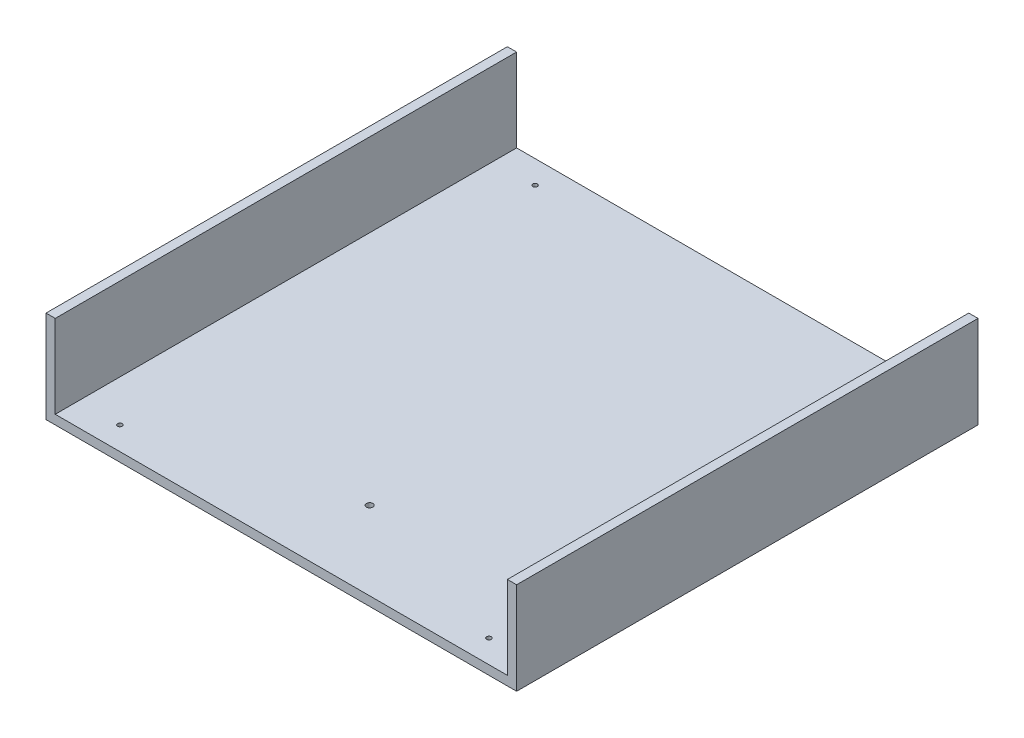
ISO-10303-21;
HEADER;
FILE_DESCRIPTION(('STEP AP214'),'2;1');
FILE_NAME('part.step','',(''),(''),'','','');
FILE_SCHEMA(('AUTOMOTIVE_DESIGN { 1 0 10303 214 1 1 1 1 }'));
ENDSEC;
DATA;
#1=APPLICATION_CONTEXT('core data for automotive mechanical design processes');
#2=APPLICATION_PROTOCOL_DEFINITION('international standard','automotive_design',2000,#1);
#3=PRODUCT_CONTEXT('',#1,'mechanical');
#4=PRODUCT('Part','Part','',(#3));
#5=PRODUCT_RELATED_PRODUCT_CATEGORY('part','',(#4));
#6=PRODUCT_DEFINITION_FORMATION('','',#4);
#7=PRODUCT_DEFINITION_CONTEXT('part definition',#1,'design');
#8=PRODUCT_DEFINITION('design','',#6,#7);
#9=PRODUCT_DEFINITION_SHAPE('','',#8);
#10=(LENGTH_UNIT() NAMED_UNIT(*) SI_UNIT(.MILLI.,.METRE.));
#11=(NAMED_UNIT(*) PLANE_ANGLE_UNIT() SI_UNIT($,.RADIAN.));
#12=(NAMED_UNIT(*) SI_UNIT($,.STERADIAN.) SOLID_ANGLE_UNIT());
#13=UNCERTAINTY_MEASURE_WITH_UNIT(LENGTH_MEASURE(1.E-05),#10,'distance_accuracy_value','');
#14=(GEOMETRIC_REPRESENTATION_CONTEXT(3) GLOBAL_UNCERTAINTY_ASSIGNED_CONTEXT((#13)) GLOBAL_UNIT_ASSIGNED_CONTEXT((#10,
#11,#12)) REPRESENTATION_CONTEXT('',''));
#15=CARTESIAN_POINT('',(0.,0.,0.));
#16=DIRECTION('',(0.,0.,1.));
#17=DIRECTION('',(1.,0.,0.));
#18=AXIS2_PLACEMENT_3D('',#15,#16,#17);
#19=CARTESIAN_POINT('',(0.,10.,0.));
#20=DIRECTION('',(0.,-1.,0.));
#21=DIRECTION('',(0.,0.,-1.));
#22=AXIS2_PLACEMENT_3D('',#19,#20,#21);
#23=PLANE('',#22);
#24=DIRECTION('',(1.,0.,0.));
#25=VECTOR('',#24,1.);
#26=CARTESIAN_POINT('',(-25.5,10.,25.));
#27=LINE('',#26,#25);
#28=CARTESIAN_POINT('',(-25.5,10.,25.));
#29=VERTEX_POINT('',#28);
#30=CARTESIAN_POINT('',(-24.5,10.,25.));
#31=VERTEX_POINT('',#30);
#32=EDGE_CURVE('E176',#29,#31,#27,.T.);
#33=ORIENTED_EDGE('',*,*,#32,.T.);
#34=DIRECTION('',(0.,0.,1.));
#35=VECTOR('',#34,1.);
#36=CARTESIAN_POINT('',(-24.5,10.,-25.));
#37=LINE('',#36,#35);
#38=CARTESIAN_POINT('',(-24.5,10.,-25.));
#39=VERTEX_POINT('',#38);
#40=EDGE_CURVE('E159',#39,#31,#37,.T.);
#41=ORIENTED_EDGE('',*,*,#40,.F.);
#42=DIRECTION('',(-1.,0.,0.));
#43=VECTOR('',#42,1.);
#44=CARTESIAN_POINT('',(-25.5,10.,-25.));
#45=LINE('',#44,#43);
#46=CARTESIAN_POINT('',(-25.5,10.,-25.));
#47=VERTEX_POINT('',#46);
#48=EDGE_CURVE('E142',#39,#47,#45,.T.);
#49=ORIENTED_EDGE('',*,*,#48,.T.);
#50=DIRECTION('',(0.,0.,1.));
#51=VECTOR('',#50,1.);
#52=CARTESIAN_POINT('',(-25.5,10.,25.));
#53=LINE('',#52,#51);
#54=EDGE_CURVE('E173',#47,#29,#53,.T.);
#55=ORIENTED_EDGE('',*,*,#54,.T.);
#56=EDGE_LOOP('',(#33,#41,#49,#55));
#57=FACE_BOUND('',#56,.T.);
#58=ADVANCED_FACE('F43',(#57),#23,.F.);
#59=CARTESIAN_POINT('',(25.5,10.,25.));
#60=DIRECTION('',(-1.,0.,0.));
#61=DIRECTION('',(0.,0.,1.));
#62=AXIS2_PLACEMENT_3D('',#59,#60,#61);
#63=PLANE('',#62);
#64=DIRECTION('',(0.,0.,-1.));
#65=VECTOR('',#64,1.);
#66=CARTESIAN_POINT('',(25.5,0.,25.));
#67=LINE('',#66,#65);
#68=CARTESIAN_POINT('',(25.5,0.,25.));
#69=VERTEX_POINT('',#68);
#70=CARTESIAN_POINT('',(25.5,0.,-25.));
#71=VERTEX_POINT('',#70);
#72=EDGE_CURVE('E162',#69,#71,#67,.T.);
#73=ORIENTED_EDGE('',*,*,#72,.T.);
#74=DIRECTION('',(0.,-1.,0.));
#75=VECTOR('',#74,1.);
#76=CARTESIAN_POINT('',(25.5,10.,-25.));
#77=LINE('',#76,#75);
#78=CARTESIAN_POINT('',(25.5,10.,-25.));
#79=VERTEX_POINT('',#78);
#80=EDGE_CURVE('E11',#79,#71,#77,.T.);
#81=ORIENTED_EDGE('',*,*,#80,.F.);
#82=DIRECTION('',(0.,0.,-1.));
#83=VECTOR('',#82,1.);
#84=CARTESIAN_POINT('',(25.5,10.,25.));
#85=LINE('',#84,#83);
#86=CARTESIAN_POINT('',(25.5,10.,25.));
#87=VERTEX_POINT('',#86);
#88=EDGE_CURVE('E168',#87,#79,#85,.T.);
#89=ORIENTED_EDGE('',*,*,#88,.F.);
#90=DIRECTION('',(0.,-1.,0.));
#91=VECTOR('',#90,1.);
#92=CARTESIAN_POINT('',(25.5,10.,25.));
#93=LINE('',#92,#91);
#94=EDGE_CURVE('E180',#87,#69,#93,.T.);
#95=ORIENTED_EDGE('',*,*,#94,.T.);
#96=EDGE_LOOP('',(#73,#81,#89,#95));
#97=FACE_BOUND('',#96,.T.);
#98=ADVANCED_FACE('F45',(#97),#63,.F.);
#99=CARTESIAN_POINT('',(-25.5,10.,-25.));
#100=DIRECTION('',(0.,0.,1.));
#101=DIRECTION('',(1.,0.,0.));
#102=AXIS2_PLACEMENT_3D('',#99,#100,#101);
#103=PLANE('',#102);
#104=ORIENTED_EDGE('',*,*,#48,.F.);
#105=DIRECTION('',(0.,-1.,0.));
#106=VECTOR('',#105,1.);
#107=CARTESIAN_POINT('',(-24.5,1.,-25.));
#108=LINE('',#107,#106);
#109=CARTESIAN_POINT('',(-24.5,1.,-25.));
#110=VERTEX_POINT('',#109);
#111=EDGE_CURVE('E122',#39,#110,#108,.T.);
#112=ORIENTED_EDGE('',*,*,#111,.T.);
#113=DIRECTION('',(1.,0.,0.));
#114=VECTOR('',#113,1.);
#115=CARTESIAN_POINT('',(-24.5,1.,-25.));
#116=LINE('',#115,#114);
#117=CARTESIAN_POINT('',(24.5,1.,-25.));
#118=VERTEX_POINT('',#117);
#119=EDGE_CURVE('E134',#110,#118,#116,.T.);
#120=ORIENTED_EDGE('',*,*,#119,.T.);
#121=DIRECTION('',(0.,1.,0.));
#122=VECTOR('',#121,1.);
#123=CARTESIAN_POINT('',(24.5,1.,-25.));
#124=LINE('',#123,#122);
#125=CARTESIAN_POINT('',(24.5,10.,-25.));
#126=VERTEX_POINT('',#125);
#127=EDGE_CURVE('E131',#118,#126,#124,.T.);
#128=ORIENTED_EDGE('',*,*,#127,.T.);
#129=EDGE_CURVE('E96',#79,#126,#45,.T.);
#130=ORIENTED_EDGE('',*,*,#129,.F.);
#131=ORIENTED_EDGE('',*,*,#80,.T.);
#132=DIRECTION('',(-1.,0.,0.));
#133=VECTOR('',#132,1.);
#134=CARTESIAN_POINT('',(-25.5,0.,-25.));
#135=LINE('',#134,#133);
#136=CARTESIAN_POINT('',(-25.5,0.,-25.));
#137=VERTEX_POINT('',#136);
#138=EDGE_CURVE('E184',#71,#137,#135,.T.);
#139=ORIENTED_EDGE('',*,*,#138,.T.);
#140=DIRECTION('',(0.,-1.,0.));
#141=VECTOR('',#140,1.);
#142=CARTESIAN_POINT('',(-25.5,10.,-25.));
#143=LINE('',#142,#141);
#144=EDGE_CURVE('E52',#47,#137,#143,.T.);
#145=ORIENTED_EDGE('',*,*,#144,.F.);
#146=EDGE_LOOP('',(#104,#112,#120,#128,#130,#131,#139,#145));
#147=FACE_BOUND('',#146,.T.);
#148=ADVANCED_FACE('F140',(#147),#103,.F.);
#149=CARTESIAN_POINT('',(-25.5,10.,25.));
#150=DIRECTION('',(1.,0.,0.));
#151=DIRECTION('',(0.,0.,-1.));
#152=AXIS2_PLACEMENT_3D('',#149,#150,#151);
#153=PLANE('',#152);
#154=DIRECTION('',(0.,0.,1.));
#155=VECTOR('',#154,1.);
#156=CARTESIAN_POINT('',(-25.5,0.,25.));
#157=LINE('',#156,#155);
#158=CARTESIAN_POINT('',(-25.5,0.,25.));
#159=VERTEX_POINT('',#158);
#160=EDGE_CURVE('E187',#137,#159,#157,.T.);
#161=ORIENTED_EDGE('',*,*,#160,.T.);
#162=DIRECTION('',(0.,-1.,0.));
#163=VECTOR('',#162,1.);
#164=CARTESIAN_POINT('',(-25.5,10.,25.));
#165=LINE('',#164,#163);
#166=EDGE_CURVE('E194',#29,#159,#165,.T.);
#167=ORIENTED_EDGE('',*,*,#166,.F.);
#168=ORIENTED_EDGE('',*,*,#54,.F.);
#169=ORIENTED_EDGE('',*,*,#144,.T.);
#170=EDGE_LOOP('',(#161,#167,#168,#169));
#171=FACE_BOUND('',#170,.T.);
#172=ADVANCED_FACE('F201',(#171),#153,.F.);
#173=CARTESIAN_POINT('',(-25.5,10.,25.));
#174=DIRECTION('',(0.,0.,-1.));
#175=DIRECTION('',(-1.,0.,0.));
#176=AXIS2_PLACEMENT_3D('',#173,#174,#175);
#177=PLANE('',#176);
#178=DIRECTION('',(1.,0.,0.));
#179=VECTOR('',#178,1.);
#180=CARTESIAN_POINT('',(-24.5,1.,25.));
#181=LINE('',#180,#179);
#182=CARTESIAN_POINT('',(-24.5,1.,25.));
#183=VERTEX_POINT('',#182);
#184=CARTESIAN_POINT('',(24.5,1.,25.));
#185=VERTEX_POINT('',#184);
#186=EDGE_CURVE('E146',#183,#185,#181,.T.);
#187=ORIENTED_EDGE('',*,*,#186,.F.);
#188=DIRECTION('',(0.,-1.,0.));
#189=VECTOR('',#188,1.);
#190=CARTESIAN_POINT('',(-24.5,1.,25.));
#191=LINE('',#190,#189);
#192=EDGE_CURVE('E125',#31,#183,#191,.T.);
#193=ORIENTED_EDGE('',*,*,#192,.F.);
#194=ORIENTED_EDGE('',*,*,#32,.F.);
#195=ORIENTED_EDGE('',*,*,#166,.T.);
#196=DIRECTION('',(1.,0.,0.));
#197=VECTOR('',#196,1.);
#198=CARTESIAN_POINT('',(-25.5,0.,25.));
#199=LINE('',#198,#197);
#200=EDGE_CURVE('E89',#159,#69,#199,.T.);
#201=ORIENTED_EDGE('',*,*,#200,.T.);
#202=ORIENTED_EDGE('',*,*,#94,.F.);
#203=CARTESIAN_POINT('',(24.5,10.,25.));
#204=VERTEX_POINT('',#203);
#205=EDGE_CURVE('E67',#204,#87,#27,.T.);
#206=ORIENTED_EDGE('',*,*,#205,.F.);
#207=DIRECTION('',(0.,1.,0.));
#208=VECTOR('',#207,1.);
#209=CARTESIAN_POINT('',(24.5,1.,25.));
#210=LINE('',#209,#208);
#211=EDGE_CURVE('E59',#185,#204,#210,.T.);
#212=ORIENTED_EDGE('',*,*,#211,.F.);
#213=EDGE_LOOP('',(#187,#193,#194,#195,#201,#202,#206,#212));
#214=FACE_BOUND('',#213,.T.);
#215=ADVANCED_FACE('F209',(#214),#177,.F.);
#216=ORIENTED_EDGE('',*,*,#129,.T.);
#217=DIRECTION('',(0.,0.,1.));
#218=VECTOR('',#217,1.);
#219=CARTESIAN_POINT('',(24.5,10.,-25.));
#220=LINE('',#219,#218);
#221=EDGE_CURVE('E163',#126,#204,#220,.T.);
#222=ORIENTED_EDGE('',*,*,#221,.T.);
#223=ORIENTED_EDGE('',*,*,#205,.T.);
#224=ORIENTED_EDGE('',*,*,#88,.T.);
#225=EDGE_LOOP('',(#216,#222,#223,#224));
#226=FACE_BOUND('',#225,.T.);
#227=ADVANCED_FACE('F216',(#226),#23,.F.);
#228=CARTESIAN_POINT('',(0.,0.,0.));
#229=DIRECTION('',(0.,-1.,0.));
#230=DIRECTION('',(0.,0.,-1.));
#231=AXIS2_PLACEMENT_3D('',#228,#229,#230);
#232=PLANE('',#231);
#233=CARTESIAN_POINT('',(1.07735026918964,0.,16.5));
#234=DIRECTION('',(0.,-1.,0.));
#235=DIRECTION('',(0.,0.,-1.));
#236=AXIS2_PLACEMENT_3D('',#233,#234,#235);
#237=CIRCLE('',#236,0.35);
#238=CARTESIAN_POINT('',(1.07735026918964,0.,16.15));
#239=VERTEX_POINT('',#238);
#240=EDGE_CURVE('E263',#239,#239,#237,.F.);
#241=ORIENTED_EDGE('',*,*,#240,.T.);
#242=EDGE_LOOP('',(#241));
#243=FACE_BOUND('',#242,.T.);
#244=CARTESIAN_POINT('',(20.,0.,22.5));
#245=DIRECTION('',(0.,-1.,0.));
#246=DIRECTION('',(0.,0.,-1.));
#247=AXIS2_PLACEMENT_3D('',#244,#245,#246);
#248=CIRCLE('',#247,0.25);
#249=CARTESIAN_POINT('',(20.,0.,22.25));
#250=VERTEX_POINT('',#249);
#251=EDGE_CURVE('E268',#250,#250,#248,.F.);
#252=ORIENTED_EDGE('',*,*,#251,.T.);
#253=EDGE_LOOP('',(#252));
#254=FACE_BOUND('',#253,.T.);
#255=CARTESIAN_POINT('',(-20.,0.,22.5));
#256=DIRECTION('',(0.,-1.,0.));
#257=DIRECTION('',(0.,0.,-1.));
#258=AXIS2_PLACEMENT_3D('',#255,#256,#257);
#259=CIRCLE('',#258,0.25);
#260=CARTESIAN_POINT('',(-20.,0.,22.25));
#261=VERTEX_POINT('',#260);
#262=EDGE_CURVE('E279',#261,#261,#259,.F.);
#263=ORIENTED_EDGE('',*,*,#262,.T.);
#264=EDGE_LOOP('',(#263));
#265=FACE_BOUND('',#264,.T.);
#266=CARTESIAN_POINT('',(20.,0.,-22.5));
#267=DIRECTION('',(0.,-1.,0.));
#268=DIRECTION('',(0.,0.,-1.));
#269=AXIS2_PLACEMENT_3D('',#266,#267,#268);
#270=CIRCLE('',#269,0.25);
#271=CARTESIAN_POINT('',(20.,0.,-22.75));
#272=VERTEX_POINT('',#271);
#273=EDGE_CURVE('E285',#272,#272,#270,.F.);
#274=ORIENTED_EDGE('',*,*,#273,.T.);
#275=EDGE_LOOP('',(#274));
#276=FACE_BOUND('',#275,.T.);
#277=CARTESIAN_POINT('',(-20.,0.,-22.5));
#278=DIRECTION('',(0.,-1.,0.));
#279=DIRECTION('',(0.,0.,-1.));
#280=AXIS2_PLACEMENT_3D('',#277,#278,#279);
#281=CIRCLE('',#280,0.25);
#282=CARTESIAN_POINT('',(-20.,0.,-22.75));
#283=VERTEX_POINT('',#282);
#284=EDGE_CURVE('E149',#283,#283,#281,.F.);
#285=ORIENTED_EDGE('',*,*,#284,.T.);
#286=EDGE_LOOP('',(#285));
#287=FACE_BOUND('',#286,.T.);
#288=ORIENTED_EDGE('',*,*,#72,.F.);
#289=ORIENTED_EDGE('',*,*,#200,.F.);
#290=ORIENTED_EDGE('',*,*,#160,.F.);
#291=ORIENTED_EDGE('',*,*,#138,.F.);
#292=EDGE_LOOP('',(#288,#289,#290,#291));
#293=FACE_BOUND('',#292,.T.);
#294=ADVANCED_FACE('F205',(#243,#254,#265,#276,#287,#293),#232,.T.);
#295=CARTESIAN_POINT('',(-24.5,1.,-25.));
#296=DIRECTION('',(-1.,0.,0.));
#297=DIRECTION('',(0.,0.,1.));
#298=AXIS2_PLACEMENT_3D('',#295,#296,#297);
#299=PLANE('',#298);
#300=ORIENTED_EDGE('',*,*,#192,.T.);
#301=DIRECTION('',(0.,0.,1.));
#302=VECTOR('',#301,1.);
#303=CARTESIAN_POINT('',(-24.5,1.,-25.));
#304=LINE('',#303,#302);
#305=EDGE_CURVE('E118',#110,#183,#304,.T.);
#306=ORIENTED_EDGE('',*,*,#305,.F.);
#307=ORIENTED_EDGE('',*,*,#111,.F.);
#308=ORIENTED_EDGE('',*,*,#40,.T.);
#309=EDGE_LOOP('',(#300,#306,#307,#308));
#310=FACE_BOUND('',#309,.T.);
#311=ADVANCED_FACE('F120',(#310),#299,.F.);
#312=CARTESIAN_POINT('',(24.5,1.,-25.));
#313=DIRECTION('',(1.,0.,0.));
#314=DIRECTION('',(0.,0.,-1.));
#315=AXIS2_PLACEMENT_3D('',#312,#313,#314);
#316=PLANE('',#315);
#317=ORIENTED_EDGE('',*,*,#211,.T.);
#318=ORIENTED_EDGE('',*,*,#221,.F.);
#319=ORIENTED_EDGE('',*,*,#127,.F.);
#320=DIRECTION('',(0.,0.,1.));
#321=VECTOR('',#320,1.);
#322=CARTESIAN_POINT('',(24.5,1.,-25.));
#323=LINE('',#322,#321);
#324=EDGE_CURVE('E130',#118,#185,#323,.T.);
#325=ORIENTED_EDGE('',*,*,#324,.T.);
#326=EDGE_LOOP('',(#317,#318,#319,#325));
#327=FACE_BOUND('',#326,.T.);
#328=ADVANCED_FACE('F229',(#327),#316,.F.);
#329=CARTESIAN_POINT('',(-24.5,1.,-25.));
#330=DIRECTION('',(0.,-1.,0.));
#331=DIRECTION('',(0.,0.,-1.));
#332=AXIS2_PLACEMENT_3D('',#329,#330,#331);
#333=PLANE('',#332);
#334=CARTESIAN_POINT('',(1.07735026918964,1.,16.5));
#335=DIRECTION('',(0.,1.,0.));
#336=DIRECTION('',(0.,0.,1.));
#337=AXIS2_PLACEMENT_3D('',#334,#335,#336);
#338=CIRCLE('',#337,0.35);
#339=CARTESIAN_POINT('',(1.07735026918964,1.,16.85));
#340=VERTEX_POINT('',#339);
#341=EDGE_CURVE('E266',#340,#340,#338,.T.);
#342=ORIENTED_EDGE('',*,*,#341,.F.);
#343=EDGE_LOOP('',(#342));
#344=FACE_BOUND('',#343,.T.);
#345=CARTESIAN_POINT('',(20.,1.,22.5));
#346=DIRECTION('',(0.,1.,0.));
#347=DIRECTION('',(0.,0.,1.));
#348=AXIS2_PLACEMENT_3D('',#345,#346,#347);
#349=CIRCLE('',#348,0.25);
#350=CARTESIAN_POINT('',(20.,1.,22.75));
#351=VERTEX_POINT('',#350);
#352=EDGE_CURVE('E273',#351,#351,#349,.T.);
#353=ORIENTED_EDGE('',*,*,#352,.F.);
#354=EDGE_LOOP('',(#353));
#355=FACE_BOUND('',#354,.T.);
#356=CARTESIAN_POINT('',(-20.,1.,22.5));
#357=DIRECTION('',(0.,1.,0.));
#358=DIRECTION('',(0.,0.,1.));
#359=AXIS2_PLACEMENT_3D('',#356,#357,#358);
#360=CIRCLE('',#359,0.25);
#361=CARTESIAN_POINT('',(-20.,1.,22.75));
#362=VERTEX_POINT('',#361);
#363=EDGE_CURVE('E281',#362,#362,#360,.T.);
#364=ORIENTED_EDGE('',*,*,#363,.F.);
#365=EDGE_LOOP('',(#364));
#366=FACE_BOUND('',#365,.T.);
#367=CARTESIAN_POINT('',(20.,1.,-22.5));
#368=DIRECTION('',(0.,1.,0.));
#369=DIRECTION('',(0.,0.,1.));
#370=AXIS2_PLACEMENT_3D('',#367,#368,#369);
#371=CIRCLE('',#370,0.25);
#372=CARTESIAN_POINT('',(20.,1.,-22.25));
#373=VERTEX_POINT('',#372);
#374=EDGE_CURVE('E289',#373,#373,#371,.T.);
#375=ORIENTED_EDGE('',*,*,#374,.F.);
#376=EDGE_LOOP('',(#375));
#377=FACE_BOUND('',#376,.T.);
#378=CARTESIAN_POINT('',(-20.,1.,-22.5));
#379=DIRECTION('',(0.,1.,0.));
#380=DIRECTION('',(0.,0.,1.));
#381=AXIS2_PLACEMENT_3D('',#378,#379,#380);
#382=CIRCLE('',#381,0.25);
#383=CARTESIAN_POINT('',(-20.,1.,-22.25));
#384=VERTEX_POINT('',#383);
#385=EDGE_CURVE('E156',#384,#384,#382,.T.);
#386=ORIENTED_EDGE('',*,*,#385,.F.);
#387=EDGE_LOOP('',(#386));
#388=FACE_BOUND('',#387,.T.);
#389=ORIENTED_EDGE('',*,*,#186,.T.);
#390=ORIENTED_EDGE('',*,*,#324,.F.);
#391=ORIENTED_EDGE('',*,*,#119,.F.);
#392=ORIENTED_EDGE('',*,*,#305,.T.);
#393=EDGE_LOOP('',(#389,#390,#391,#392));
#394=FACE_BOUND('',#393,.T.);
#395=ADVANCED_FACE('F135',(#344,#355,#366,#377,#388,#394),#333,.F.);
#396=CARTESIAN_POINT('',(-20.,-0.000999999999999916,-22.5));
#397=DIRECTION('',(0.,1.,0.));
#398=DIRECTION('',(0.,0.,1.));
#399=AXIS2_PLACEMENT_3D('',#396,#397,#398);
#400=CYLINDRICAL_SURFACE('',#399,0.25);
#401=ORIENTED_EDGE('',*,*,#284,.F.);
#402=EDGE_LOOP('',(#401));
#403=FACE_BOUND('',#402,.T.);
#404=ORIENTED_EDGE('',*,*,#385,.T.);
#405=EDGE_LOOP('',(#404));
#406=FACE_BOUND('',#405,.T.);
#407=ADVANCED_FACE('F236',(#403,#406),#400,.F.);
#408=CARTESIAN_POINT('',(20.,-0.000999999999999916,-22.5));
#409=DIRECTION('',(0.,1.,0.));
#410=DIRECTION('',(0.,0.,1.));
#411=AXIS2_PLACEMENT_3D('',#408,#409,#410);
#412=CYLINDRICAL_SURFACE('',#411,0.25);
#413=ORIENTED_EDGE('',*,*,#273,.F.);
#414=EDGE_LOOP('',(#413));
#415=FACE_BOUND('',#414,.T.);
#416=ORIENTED_EDGE('',*,*,#374,.T.);
#417=EDGE_LOOP('',(#416));
#418=FACE_BOUND('',#417,.T.);
#419=ADVANCED_FACE('F242',(#415,#418),#412,.F.);
#420=CARTESIAN_POINT('',(-20.,-0.000999999999999916,22.5));
#421=DIRECTION('',(0.,1.,0.));
#422=DIRECTION('',(0.,0.,1.));
#423=AXIS2_PLACEMENT_3D('',#420,#421,#422);
#424=CYLINDRICAL_SURFACE('',#423,0.25);
#425=ORIENTED_EDGE('',*,*,#262,.F.);
#426=EDGE_LOOP('',(#425));
#427=FACE_BOUND('',#426,.T.);
#428=ORIENTED_EDGE('',*,*,#363,.T.);
#429=EDGE_LOOP('',(#428));
#430=FACE_BOUND('',#429,.T.);
#431=ADVANCED_FACE('F246',(#427,#430),#424,.F.);
#432=CARTESIAN_POINT('',(20.,-0.000999999999999916,22.5));
#433=DIRECTION('',(0.,1.,0.));
#434=DIRECTION('',(0.,0.,1.));
#435=AXIS2_PLACEMENT_3D('',#432,#433,#434);
#436=CYLINDRICAL_SURFACE('',#435,0.25);
#437=ORIENTED_EDGE('',*,*,#251,.F.);
#438=EDGE_LOOP('',(#437));
#439=FACE_BOUND('',#438,.T.);
#440=ORIENTED_EDGE('',*,*,#352,.T.);
#441=EDGE_LOOP('',(#440));
#442=FACE_BOUND('',#441,.T.);
#443=ADVANCED_FACE('F250',(#439,#442),#436,.F.);
#444=CARTESIAN_POINT('',(1.07735026918964,-0.000999999999999916,16.5));
#445=DIRECTION('',(0.,1.,0.));
#446=DIRECTION('',(0.,0.,1.));
#447=AXIS2_PLACEMENT_3D('',#444,#445,#446);
#448=CYLINDRICAL_SURFACE('',#447,0.35);
#449=ORIENTED_EDGE('',*,*,#240,.F.);
#450=EDGE_LOOP('',(#449));
#451=FACE_BOUND('',#450,.T.);
#452=ORIENTED_EDGE('',*,*,#341,.T.);
#453=EDGE_LOOP('',(#452));
#454=FACE_BOUND('',#453,.T.);
#455=ADVANCED_FACE('F254',(#451,#454),#448,.F.);
#456=CLOSED_SHELL('',(#58,#98,#148,#172,#215,#227,#294,#311,#328,#395,#407,#419,#431,#443,#455));
#457=MANIFOLD_SOLID_BREP('B2',#456);
#458=ADVANCED_BREP_SHAPE_REPRESENTATION('',(#18,#457),#14);
#459=SHAPE_DEFINITION_REPRESENTATION(#9,#458);
ENDSEC;
END-ISO-10303-21;
